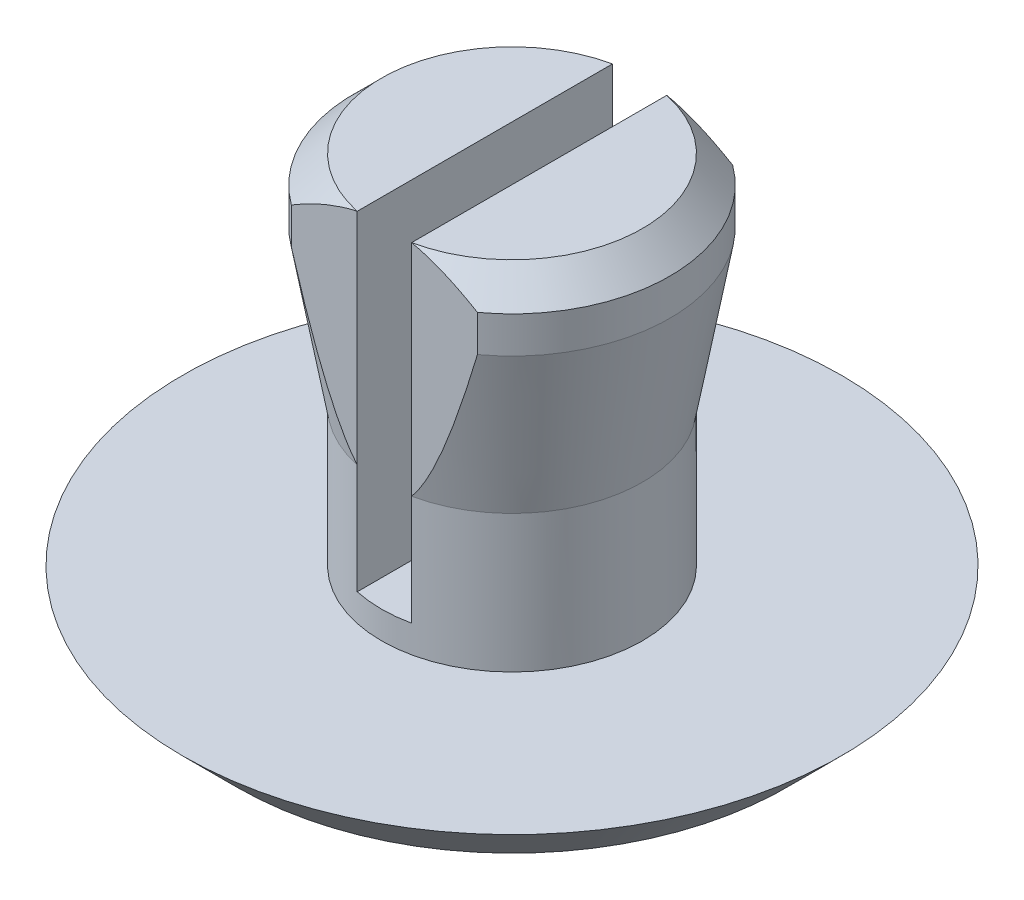
ISO-10303-21;
HEADER;
FILE_DESCRIPTION(('STEP AP214'),'2;1');
FILE_NAME('part.step','',(''),(''),'','','');
FILE_SCHEMA(('AUTOMOTIVE_DESIGN { 1 0 10303 214 1 1 1 1 }'));
ENDSEC;
DATA;
#1=APPLICATION_CONTEXT('core data for automotive mechanical design processes');
#2=APPLICATION_PROTOCOL_DEFINITION('international standard','automotive_design',2000,#1);
#3=PRODUCT_CONTEXT('',#1,'mechanical');
#4=PRODUCT('Part','Part','',(#3));
#5=PRODUCT_RELATED_PRODUCT_CATEGORY('part','',(#4));
#6=PRODUCT_DEFINITION_FORMATION('','',#4);
#7=PRODUCT_DEFINITION_CONTEXT('part definition',#1,'design');
#8=PRODUCT_DEFINITION('design','',#6,#7);
#9=PRODUCT_DEFINITION_SHAPE('','',#8);
#10=(LENGTH_UNIT() NAMED_UNIT(*) SI_UNIT(.MILLI.,.METRE.));
#11=(NAMED_UNIT(*) PLANE_ANGLE_UNIT() SI_UNIT($,.RADIAN.));
#12=(NAMED_UNIT(*) SI_UNIT($,.STERADIAN.) SOLID_ANGLE_UNIT());
#13=UNCERTAINTY_MEASURE_WITH_UNIT(LENGTH_MEASURE(1.E-05),#10,'distance_accuracy_value','');
#14=(GEOMETRIC_REPRESENTATION_CONTEXT(3) GLOBAL_UNCERTAINTY_ASSIGNED_CONTEXT((#13)) GLOBAL_UNIT_ASSIGNED_CONTEXT((#10,
#11,#12)) REPRESENTATION_CONTEXT('',''));
#15=CARTESIAN_POINT('',(0.,0.,0.));
#16=DIRECTION('',(0.,0.,1.));
#17=DIRECTION('',(1.,0.,0.));
#18=AXIS2_PLACEMENT_3D('',#15,#16,#17);
#19=CARTESIAN_POINT('',(0.,13.,0.));
#20=DIRECTION('',(0.,-1.,0.));
#21=DIRECTION('',(0.,0.,-1.));
#22=AXIS2_PLACEMENT_3D('',#19,#20,#21);
#23=CYLINDRICAL_SURFACE('',#22,4.75);
#24=CARTESIAN_POINT('',(0.,0.,0.));
#25=DIRECTION('',(0.,1.,0.));
#26=DIRECTION('',(0.,0.,1.));
#27=AXIS2_PLACEMENT_3D('',#24,#25,#26);
#28=CIRCLE('',#27,4.75);
#29=CARTESIAN_POINT('',(0.,0.,4.75));
#30=VERTEX_POINT('',#29);
#31=EDGE_CURVE('E165',#30,#30,#28,.T.);
#32=ORIENTED_EDGE('',*,*,#31,.T.);
#33=EDGE_LOOP('',(#32));
#34=FACE_BOUND('',#33,.T.);
#35=DIRECTION('',(0.,1.,0.));
#36=VECTOR('',#35,1.);
#37=CARTESIAN_POINT('',(0.989583333333333,0.999999999999999,-4.64577494357926));
#38=LINE('',#37,#36);
#39=CARTESIAN_POINT('',(0.989583333333333,0.999999999999999,-4.64577494357926));
#40=VERTEX_POINT('',#39);
#41=CARTESIAN_POINT('',(0.989583333333333,4.99999999999999,-4.64577494357926));
#42=VERTEX_POINT('',#41);
#43=EDGE_CURVE('E156',#40,#42,#38,.T.);
#44=ORIENTED_EDGE('',*,*,#43,.T.);
#45=CARTESIAN_POINT('',(0.,4.99999999999999,0.));
#46=DIRECTION('',(0.,1.,0.));
#47=DIRECTION('',(0.,0.,1.));
#48=AXIS2_PLACEMENT_3D('',#45,#46,#47);
#49=CIRCLE('',#48,4.75);
#50=CARTESIAN_POINT('',(0.989583333333333,4.99999999999999,4.64577494357926));
#51=VERTEX_POINT('',#50);
#52=EDGE_CURVE('E174',#42,#51,#49,.F.);
#53=ORIENTED_EDGE('',*,*,#52,.T.);
#54=DIRECTION('',(0.,1.,0.));
#55=VECTOR('',#54,1.);
#56=CARTESIAN_POINT('',(0.989583333333333,0.999999999999999,4.64577494357926));
#57=LINE('',#56,#55);
#58=CARTESIAN_POINT('',(0.989583333333333,0.999999999999999,4.64577494357926));
#59=VERTEX_POINT('',#58);
#60=EDGE_CURVE('E159',#59,#51,#57,.T.);
#61=ORIENTED_EDGE('',*,*,#60,.F.);
#62=CARTESIAN_POINT('',(0.,0.999999999999999,0.));
#63=DIRECTION('',(0.,1.,0.));
#64=DIRECTION('',(0.,0.,1.));
#65=AXIS2_PLACEMENT_3D('',#62,#63,#64);
#66=CIRCLE('',#65,4.75);
#67=CARTESIAN_POINT('',(-0.989583333333333,0.999999999999999,4.64577494357926));
#68=VERTEX_POINT('',#67);
#69=EDGE_CURVE('E140',#68,#59,#66,.T.);
#70=ORIENTED_EDGE('',*,*,#69,.F.);
#71=DIRECTION('',(0.,1.,0.));
#72=VECTOR('',#71,1.);
#73=CARTESIAN_POINT('',(-0.989583333333333,0.999999999999999,4.64577494357926));
#74=LINE('',#73,#72);
#75=CARTESIAN_POINT('',(-0.989583333333333,4.99999999999999,4.64577494357926));
#76=VERTEX_POINT('',#75);
#77=EDGE_CURVE('E151',#68,#76,#74,.T.);
#78=ORIENTED_EDGE('',*,*,#77,.T.);
#79=CARTESIAN_POINT('',(0.,4.99999999999999,0.));
#80=DIRECTION('',(0.,1.,0.));
#81=DIRECTION('',(0.,0.,1.));
#82=AXIS2_PLACEMENT_3D('',#79,#80,#81);
#83=CIRCLE('',#82,4.75);
#84=CARTESIAN_POINT('',(-0.989583333333332,4.99999999999999,-4.64577494357926));
#85=VERTEX_POINT('',#84);
#86=EDGE_CURVE('E171',#76,#85,#83,.F.);
#87=ORIENTED_EDGE('',*,*,#86,.T.);
#88=DIRECTION('',(0.,1.,0.));
#89=VECTOR('',#88,1.);
#90=CARTESIAN_POINT('',(-0.989583333333332,0.999999999999999,-4.64577494357926));
#91=LINE('',#90,#89);
#92=CARTESIAN_POINT('',(-0.989583333333332,0.999999999999999,-4.64577494357926));
#93=VERTEX_POINT('',#92);
#94=EDGE_CURVE('E154',#93,#85,#91,.T.);
#95=ORIENTED_EDGE('',*,*,#94,.F.);
#96=CARTESIAN_POINT('',(0.,0.999999999999999,0.));
#97=DIRECTION('',(0.,1.,0.));
#98=DIRECTION('',(0.,0.,1.));
#99=AXIS2_PLACEMENT_3D('',#96,#97,#98);
#100=CIRCLE('',#99,4.75);
#101=EDGE_CURVE('E436',#40,#93,#100,.T.);
#102=ORIENTED_EDGE('',*,*,#101,.F.);
#103=EDGE_LOOP('',(#44,#53,#61,#70,#78,#87,#95,#102));
#104=FACE_BOUND('',#103,.T.);
#105=ADVANCED_FACE('F35',(#34,#104),#23,.T.);
#106=CARTESIAN_POINT('',(0.,13.,0.));
#107=DIRECTION('',(0.,1.,0.));
#108=DIRECTION('',(0.,0.,1.));
#109=AXIS2_PLACEMENT_3D('',#106,#107,#108);
#110=PLANE('',#109);
#111=DIRECTION('',(0.,0.,1.));
#112=VECTOR('',#111,1.);
#113=CARTESIAN_POINT('',(-0.989583333333333,13.,4.64577494357926));
#114=LINE('',#113,#112);
#115=CARTESIAN_POINT('',(-0.989583333333332,13.,-4.64577494357926));
#116=VERTEX_POINT('',#115);
#117=CARTESIAN_POINT('',(-0.989583333333333,13.,4.64577494357926));
#118=VERTEX_POINT('',#117);
#119=EDGE_CURVE('E124',#116,#118,#114,.T.);
#120=ORIENTED_EDGE('',*,*,#119,.F.);
#121=CARTESIAN_POINT('',(0.,13.,0.));
#122=DIRECTION('',(0.,1.,0.));
#123=DIRECTION('',(0.,0.,1.));
#124=AXIS2_PLACEMENT_3D('',#121,#122,#123);
#125=CIRCLE('',#124,4.75000000000001);
#126=EDGE_CURVE('E118',#116,#118,#125,.T.);
#127=ORIENTED_EDGE('',*,*,#126,.T.);
#128=EDGE_LOOP('',(#120,#127));
#129=FACE_BOUND('',#128,.T.);
#130=ADVANCED_FACE('F122',(#129),#110,.T.);
#131=DIRECTION('',(0.,0.,-1.));
#132=VECTOR('',#131,1.);
#133=CARTESIAN_POINT('',(0.989583333333333,13.,4.64577494357926));
#134=LINE('',#133,#132);
#135=CARTESIAN_POINT('',(0.989583333333333,13.,4.64577494357926));
#136=VERTEX_POINT('',#135);
#137=CARTESIAN_POINT('',(0.989583333333333,13.,-4.64577494357926));
#138=VERTEX_POINT('',#137);
#139=EDGE_CURVE('E141',#136,#138,#134,.T.);
#140=ORIENTED_EDGE('',*,*,#139,.F.);
#141=CARTESIAN_POINT('',(0.,13.,0.));
#142=DIRECTION('',(0.,1.,0.));
#143=DIRECTION('',(0.,0.,1.));
#144=AXIS2_PLACEMENT_3D('',#141,#142,#143);
#145=CIRCLE('',#144,4.75000000000001);
#146=EDGE_CURVE('E221',#136,#138,#145,.T.);
#147=ORIENTED_EDGE('',*,*,#146,.T.);
#148=EDGE_LOOP('',(#140,#147));
#149=FACE_BOUND('',#148,.T.);
#150=ADVANCED_FACE('F259',(#149),#110,.T.);
#151=CARTESIAN_POINT('',(0.,-2.,0.));
#152=DIRECTION('',(0.,-1.,0.));
#153=DIRECTION('',(0.,0.,-1.));
#154=AXIS2_PLACEMENT_3D('',#151,#152,#153);
#155=PLANE('',#154);
#156=CARTESIAN_POINT('',(0.,-2.,0.));
#157=DIRECTION('',(0.,-1.,0.));
#158=DIRECTION('',(0.,0.,-1.));
#159=AXIS2_PLACEMENT_3D('',#156,#157,#158);
#160=CIRCLE('',#159,10.);
#161=CARTESIAN_POINT('',(0.,-2.,-10.));
#162=VERTEX_POINT('',#161);
#163=EDGE_CURVE('E168',#162,#162,#160,.T.);
#164=ORIENTED_EDGE('',*,*,#163,.T.);
#165=EDGE_LOOP('',(#164));
#166=FACE_BOUND('',#165,.T.);
#167=ADVANCED_FACE('F255',(#166),#155,.T.);
#168=CARTESIAN_POINT('',(0.,0.,0.));
#169=DIRECTION('',(0.,-1.,0.));
#170=DIRECTION('',(0.,0.,-1.));
#171=AXIS2_PLACEMENT_3D('',#168,#169,#170);
#172=PLANE('',#171);
#173=ORIENTED_EDGE('',*,*,#31,.F.);
#174=EDGE_LOOP('',(#173));
#175=FACE_BOUND('',#174,.T.);
#176=CARTESIAN_POINT('',(0.,0.,0.));
#177=DIRECTION('',(0.,-1.,0.));
#178=DIRECTION('',(0.,0.,-1.));
#179=AXIS2_PLACEMENT_3D('',#176,#177,#178);
#180=CIRCLE('',#179,12.);
#181=CARTESIAN_POINT('',(0.,0.,-12.));
#182=VERTEX_POINT('',#181);
#183=EDGE_CURVE('E153',#182,#182,#180,.T.);
#184=ORIENTED_EDGE('',*,*,#183,.F.);
#185=EDGE_LOOP('',(#184));
#186=FACE_BOUND('',#185,.T.);
#187=ADVANCED_FACE('F258',(#175,#186),#172,.F.);
#188=CARTESIAN_POINT('',(0.,-2.,0.));
#189=DIRECTION('',(0.,1.,0.));
#190=DIRECTION('',(0.,0.,1.));
#191=AXIS2_PLACEMENT_3D('',#188,#189,#190);
#192=CONICAL_SURFACE('',#191,10.,0.785398163397445);
#193=ORIENTED_EDGE('',*,*,#183,.T.);
#194=EDGE_LOOP('',(#193));
#195=FACE_BOUND('',#194,.T.);
#196=ORIENTED_EDGE('',*,*,#163,.F.);
#197=EDGE_LOOP('',(#196));
#198=FACE_BOUND('',#197,.T.);
#199=ADVANCED_FACE('F251',(#195,#198),#192,.T.);
#200=CARTESIAN_POINT('',(-0.989583333333333,0.999999999999999,4.64577494357926));
#201=DIRECTION('',(-1.,0.,0.));
#202=DIRECTION('',(0.,0.,1.));
#203=AXIS2_PLACEMENT_3D('',#200,#201,#202);
#204=PLANE('',#203);
#205=DIRECTION('',(0.,1.,0.));
#206=VECTOR('',#205,1.);
#207=CARTESIAN_POINT('',(-0.989583333333333,11.,4.64577494357926));
#208=LINE('',#207,#206);
#209=EDGE_CURVE('E128',#76,#118,#208,.T.);
#210=ORIENTED_EDGE('',*,*,#209,.F.);
#211=ORIENTED_EDGE('',*,*,#77,.F.);
#212=DIRECTION('',(0.,0.,1.));
#213=VECTOR('',#212,1.);
#214=CARTESIAN_POINT('',(-0.989583333333333,0.999999999999999,4.64577494357926));
#215=LINE('',#214,#213);
#216=EDGE_CURVE('E162',#93,#68,#215,.T.);
#217=ORIENTED_EDGE('',*,*,#216,.F.);
#218=ORIENTED_EDGE('',*,*,#94,.T.);
#219=DIRECTION('',(0.,1.,0.));
#220=VECTOR('',#219,1.);
#221=CARTESIAN_POINT('',(-0.989583333333332,11.,-4.64577494357926));
#222=LINE('',#221,#220);
#223=EDGE_CURVE('E135',#85,#116,#222,.T.);
#224=ORIENTED_EDGE('',*,*,#223,.T.);
#225=ORIENTED_EDGE('',*,*,#119,.T.);
#226=EDGE_LOOP('',(#210,#211,#217,#218,#224,#225));
#227=FACE_BOUND('',#226,.T.);
#228=ADVANCED_FACE('F138',(#227),#204,.F.);
#229=CARTESIAN_POINT('',(0.989583333333333,0.999999999999999,4.64577494357926));
#230=DIRECTION('',(1.,0.,0.));
#231=DIRECTION('',(0.,0.,-1.));
#232=AXIS2_PLACEMENT_3D('',#229,#230,#231);
#233=PLANE('',#232);
#234=DIRECTION('',(0.,1.,0.));
#235=VECTOR('',#234,1.);
#236=CARTESIAN_POINT('',(0.989583333333333,11.,-4.64577494357926));
#237=LINE('',#236,#235);
#238=EDGE_CURVE('E448',#42,#138,#237,.T.);
#239=ORIENTED_EDGE('',*,*,#238,.F.);
#240=ORIENTED_EDGE('',*,*,#43,.F.);
#241=DIRECTION('',(0.,0.,-1.));
#242=VECTOR('',#241,1.);
#243=CARTESIAN_POINT('',(0.989583333333333,0.999999999999999,4.64577494357926));
#244=LINE('',#243,#242);
#245=EDGE_CURVE('E144',#59,#40,#244,.T.);
#246=ORIENTED_EDGE('',*,*,#245,.F.);
#247=ORIENTED_EDGE('',*,*,#60,.T.);
#248=DIRECTION('',(0.,1.,0.));
#249=VECTOR('',#248,1.);
#250=CARTESIAN_POINT('',(0.989583333333333,11.,4.64577494357926));
#251=LINE('',#250,#249);
#252=EDGE_CURVE('E147',#51,#136,#251,.T.);
#253=ORIENTED_EDGE('',*,*,#252,.T.);
#254=ORIENTED_EDGE('',*,*,#139,.T.);
#255=EDGE_LOOP('',(#239,#240,#246,#247,#253,#254));
#256=FACE_BOUND('',#255,.T.);
#257=ADVANCED_FACE('F247',(#256),#233,.F.);
#258=CARTESIAN_POINT('',(0.,0.999999999999999,0.));
#259=DIRECTION('',(0.,1.,0.));
#260=DIRECTION('',(0.,0.,1.));
#261=AXIS2_PLACEMENT_3D('',#258,#259,#260);
#262=PLANE('',#261);
#263=ORIENTED_EDGE('',*,*,#69,.T.);
#264=ORIENTED_EDGE('',*,*,#245,.T.);
#265=ORIENTED_EDGE('',*,*,#101,.T.);
#266=ORIENTED_EDGE('',*,*,#216,.T.);
#267=EDGE_LOOP('',(#263,#264,#265,#266));
#268=FACE_BOUND('',#267,.T.);
#269=ADVANCED_FACE('F206',(#268),#262,.T.);
#270=CARTESIAN_POINT('',(1.19791666666667,11.,-4.64577494357926));
#271=DIRECTION('',(0.,0.,-1.));
#272=DIRECTION('',(-1.,0.,0.));
#273=AXIS2_PLACEMENT_3D('',#270,#271,#272);
#274=PLANE('',#273);
#275=ORIENTED_EDGE('',*,*,#238,.T.);
#276=CARTESIAN_POINT('',(0.989583333333374,13.,-4.64577494357926));
#277=CARTESIAN_POINT('',(1.1704144437749,12.9623485183072,-4.64577494357926));
#278=CARTESIAN_POINT('',(1.34896676657053,12.9152410110718,-4.64577494357926));
#279=CARTESIAN_POINT('',(1.70079930281116,12.80549664553,-4.64577494357926));
#280=CARTESIAN_POINT('',(1.87409139003593,12.742898220408,-4.64577494357926));
#281=CARTESIAN_POINT('',(2.21413384928068,12.6059203719835,-4.64577494357926));
#282=CARTESIAN_POINT('',(2.38092719855641,12.5316452283715,-4.64577494357926));
#283=CARTESIAN_POINT('',(2.70997280545489,12.3735370694812,-4.64577494357926));
#284=CARTESIAN_POINT('',(2.87222321243173,12.2897002276542,-4.64577494357926));
#285=CARTESIAN_POINT('',(3.09219439612242,12.169462953325,-4.64577494357926));
#286=CARTESIAN_POINT('',(3.15169531277584,12.136263771413,-4.64577494357926));
#287=CARTESIAN_POINT('',(3.27025226605008,12.0688564150114,-4.64577494357926));
#288=CARTESIAN_POINT('',(3.3293074131424,12.034646675219,-4.64577494357926));
#289=CARTESIAN_POINT('',(3.38810790465875,12.,-4.64577494357926));
#290=B_SPLINE_CURVE_WITH_KNOTS('',3,(#276,#277,#278,#279,#280,#281,#282,#283,#284,#285,#286,
#287,#288,#289),.UNSPECIFIED.,.F.,.F.,(4,2,2,2,2,2,4),(0.,0.553437571154139,1.10551558539893,
1.65291733684754,2.2005389298332,2.40494245132195,2.60968115995911),.UNSPECIFIED.);
#291=CARTESIAN_POINT('',(3.38810790465875,12.,-4.64577494357926));
#292=VERTEX_POINT('',#291);
#293=EDGE_CURVE('E213',#138,#292,#290,.T.);
#294=ORIENTED_EDGE('',*,*,#293,.T.);
#295=DIRECTION('',(0.,1.,0.));
#296=VECTOR('',#295,1.);
#297=CARTESIAN_POINT('',(3.38810790465875,11.,-4.64577494357926));
#298=LINE('',#297,#296);
#299=CARTESIAN_POINT('',(3.38810790465875,10.6712818196175,-4.64577494357926));
#300=VERTEX_POINT('',#299);
#301=EDGE_CURVE('E444',#300,#292,#298,.T.);
#302=ORIENTED_EDGE('',*,*,#301,.F.);
#303=CARTESIAN_POINT('',(3.38810790465875,10.6712818196175,-4.64577494357926));
#304=CARTESIAN_POINT('',(3.32689507981117,10.4667902059364,-4.64577494357926));
#305=CARTESIAN_POINT('',(3.26472138914247,10.2625807146368,-4.64577494357926));
#306=CARTESIAN_POINT('',(3.13802966150101,9.85485143376169,-4.64577494357926));
#307=CARTESIAN_POINT('',(3.0735112108908,9.65133177286973,-4.64577494357926));
#308=CARTESIAN_POINT('',(2.94134554328581,9.2439991590162,-4.64577494357926));
#309=CARTESIAN_POINT('',(2.87368231202682,9.04019138427731,-4.64577494357926));
#310=CARTESIAN_POINT('',(2.73500090905716,8.63373687278263,-4.64577494357926));
#311=CARTESIAN_POINT('',(2.66398304466084,8.43109003157468,-4.64577494357926));
#312=CARTESIAN_POINT('',(2.51946851941549,8.03189720066862,-4.64577494357926));
#313=CARTESIAN_POINT('',(2.44606536536933,7.83531749523216,-4.64577494357926));
#314=CARTESIAN_POINT('',(2.29427577443733,7.44409467586185,-4.64577494357926));
#315=CARTESIAN_POINT('',(2.21588974797021,7.24945140395526,-4.64577494357926));
#316=CARTESIAN_POINT('',(2.05278398587863,6.86329553279851,-4.64577494357926));
#317=CARTESIAN_POINT('',(1.96807763968195,6.67177730708104,-4.64577494357926));
#318=CARTESIAN_POINT('',(1.78992646796999,6.29287866862716,-4.64577494357926));
#319=CARTESIAN_POINT('',(1.69648643426461,6.10549605580919,-4.64577494357926));
#320=CARTESIAN_POINT('',(1.55284965792189,5.84078048423702,-4.64577494357926));
#321=CARTESIAN_POINT('',(1.50779032849719,5.76066560453151,-4.64577494357926));
#322=CARTESIAN_POINT('',(1.4146804995963,5.60222811192271,-4.64577494357926));
#323=CARTESIAN_POINT('',(1.36663118622447,5.52390480496681,-4.64577494357926));
#324=CARTESIAN_POINT('',(1.26665224880521,5.36925584519352,-4.64577494357926));
#325=CARTESIAN_POINT('',(1.21470673388737,5.29294030296848,-4.64577494357926));
#326=CARTESIAN_POINT('',(1.10600274691602,5.14364863672468,-4.64577494357926));
#327=CARTESIAN_POINT('',(1.04923662972952,5.07067811085333,-4.64577494357926));
#328=CARTESIAN_POINT('',(0.98958333333409,4.99999999999958,-4.64577494357926));
#329=B_SPLINE_CURVE_WITH_KNOTS('',3,(#303,#304,#305,#306,#307,#308,#309,#310,#311,#312,#313,
#314,#315,#316,#317,#318,#319,#320,#321,#322,#323,#324,#325,#326,#327,#328),.UNSPECIFIED.,.F.,
.F.,(4,2,2,2,2,2,2,2,2,2,2,2,4),(0.,0.640376093782088,1.28086570950586,1.92508034570645,
2.56923608011796,3.19869691712519,3.82810597504066,4.4562175664296,5.08398653977725,
5.35968560034467,5.63527598187361,5.9120588740068,6.18928922889526),.UNSPECIFIED.);
#330=EDGE_CURVE('E180',#300,#42,#329,.T.);
#331=ORIENTED_EDGE('',*,*,#330,.T.);
#332=EDGE_LOOP('',(#275,#294,#302,#331));
#333=FACE_BOUND('',#332,.T.);
#334=ADVANCED_FACE('F201',(#333),#274,.T.);
#335=CARTESIAN_POINT('',(0.,11.,0.));
#336=DIRECTION('',(0.,1.,0.));
#337=DIRECTION('',(0.,0.,1.));
#338=AXIS2_PLACEMENT_3D('',#335,#336,#337);
#339=CYLINDRICAL_SURFACE('',#338,5.75);
#340=ORIENTED_EDGE('',*,*,#301,.T.);
#341=CARTESIAN_POINT('',(0.,12.,0.));
#342=DIRECTION('',(0.,1.,0.));
#343=DIRECTION('',(0.,0.,1.));
#344=AXIS2_PLACEMENT_3D('',#341,#342,#343);
#345=CIRCLE('',#344,5.75);
#346=CARTESIAN_POINT('',(3.38810790465875,12.,4.64577494357926));
#347=VERTEX_POINT('',#346);
#348=EDGE_CURVE('E220',#292,#347,#345,.F.);
#349=ORIENTED_EDGE('',*,*,#348,.T.);
#350=DIRECTION('',(0.,1.,0.));
#351=VECTOR('',#350,1.);
#352=CARTESIAN_POINT('',(3.38810790465875,11.,4.64577494357926));
#353=LINE('',#352,#351);
#354=CARTESIAN_POINT('',(3.38810790465875,10.6712818196175,4.64577494357926));
#355=VERTEX_POINT('',#354);
#356=EDGE_CURVE('E441',#355,#347,#353,.T.);
#357=ORIENTED_EDGE('',*,*,#356,.F.);
#358=CARTESIAN_POINT('',(0.,10.6712818196175,0.));
#359=DIRECTION('',(0.,1.,0.));
#360=DIRECTION('',(0.,0.,1.));
#361=AXIS2_PLACEMENT_3D('',#358,#359,#360);
#362=CIRCLE('',#361,5.75);
#363=EDGE_CURVE('E177',#355,#300,#362,.T.);
#364=ORIENTED_EDGE('',*,*,#363,.T.);
#365=EDGE_LOOP('',(#340,#349,#357,#364));
#366=FACE_BOUND('',#365,.T.);
#367=ADVANCED_FACE('F205',(#366),#339,.T.);
#368=CARTESIAN_POINT('',(1.19791666666667,11.,4.64577494357926));
#369=DIRECTION('',(0.,0.,1.));
#370=DIRECTION('',(1.,0.,0.));
#371=AXIS2_PLACEMENT_3D('',#368,#369,#370);
#372=PLANE('',#371);
#373=ORIENTED_EDGE('',*,*,#356,.T.);
#374=CARTESIAN_POINT('',(3.38810790465875,12.,4.64577494357926));
#375=CARTESIAN_POINT('',(3.29422662968021,12.0553075510659,4.64577494357926));
#376=CARTESIAN_POINT('',(3.19968988989585,12.1095212228469,4.64577494357926));
#377=CARTESIAN_POINT('',(3.0091595590965,12.2153854547663,4.64577494357926));
#378=CARTESIAN_POINT('',(2.91316556911508,12.2670352958281,4.64577494357926));
#379=CARTESIAN_POINT('',(2.72026520531105,12.3670344088568,4.64577494357926));
#380=CARTESIAN_POINT('',(2.6233690229582,12.4154032005753,4.64577494357926));
#381=CARTESIAN_POINT('',(2.42796339905657,12.5087347285217,4.64577494357926));
#382=CARTESIAN_POINT('',(2.32945397968508,12.5536975115246,4.64577494357926));
#383=CARTESIAN_POINT('',(2.03090002461446,12.6828975386296,4.64577494357926));
#384=CARTESIAN_POINT('',(1.82819834205069,12.7612510644232,4.64577494357926));
#385=CARTESIAN_POINT('',(1.41465164980789,12.8975612788984,4.64577494357926));
#386=CARTESIAN_POINT('',(1.20376177250055,12.9553801259772,4.64577494357926));
#387=CARTESIAN_POINT('',(0.989583333333375,13.,4.64577494357926));
#388=B_SPLINE_CURVE_WITH_KNOTS('',3,(#374,#375,#376,#377,#378,#379,#380,#381,#382,#383,#384,
#385,#386,#387),.UNSPECIFIED.,.F.,.F.,(4,2,2,2,2,2,4),(0.,0.326890348493636,0.65387186768133,
0.978697073836121,1.30351781833841,1.95440810409695,2.60958847673408),.UNSPECIFIED.);
#389=EDGE_CURVE('E125',#347,#136,#388,.T.);
#390=ORIENTED_EDGE('',*,*,#389,.T.);
#391=ORIENTED_EDGE('',*,*,#252,.F.);
#392=CARTESIAN_POINT('',(0.989583333333333,4.99999999999999,4.64577494357926));
#393=CARTESIAN_POINT('',(1.04543394988145,5.06614425723856,4.64577494357926));
#394=CARTESIAN_POINT('',(1.0987426951434,5.13431856892697,4.64577494357926));
#395=CARTESIAN_POINT('',(1.20108042466068,5.27368840449876,4.64577494357926));
#396=CARTESIAN_POINT('',(1.25011479135293,5.34487995594756,4.64577494357926));
#397=CARTESIAN_POINT('',(1.34467882499284,5.48916414227866,4.64577494357926));
#398=CARTESIAN_POINT('',(1.39022025424904,5.56224917790845,4.64577494357926));
#399=CARTESIAN_POINT('',(1.47857741070101,5.71007852776741,4.64577494357926));
#400=CARTESIAN_POINT('',(1.5213921255126,5.78482344455129,4.64577494357926));
#401=CARTESIAN_POINT('',(1.64592081133834,6.01000610904117,4.64577494357926));
#402=CARTESIAN_POINT('',(1.72428939296614,6.16229094721627,4.64577494357926));
#403=CARTESIAN_POINT('',(1.87457905864565,6.47016777444215,4.64577494357926));
#404=CARTESIAN_POINT('',(1.94649275973057,6.62576330488003,4.64577494357926));
#405=CARTESIAN_POINT('',(2.08513437114091,6.93875052226328,4.64577494357926));
#406=CARTESIAN_POINT('',(2.15187535080048,7.09613644812463,4.64577494357926));
#407=CARTESIAN_POINT('',(2.28141809208066,7.41252297068559,4.64577494357926));
#408=CARTESIAN_POINT('',(2.34421957845372,7.57152367930828,4.64577494357926));
#409=CARTESIAN_POINT('',(2.52784992784527,8.05029748738869,4.64577494357926));
#410=CARTESIAN_POINT('',(2.64392563822759,8.37189102895908,4.64577494357926));
#411=CARTESIAN_POINT('',(2.86860636879878,9.02201502733891,4.64577494357926));
#412=CARTESIAN_POINT('',(2.97710329345651,9.35058227680473,4.64577494357926));
#413=CARTESIAN_POINT('',(3.13476251815817,9.84491509506291,4.64577494357926));
#414=CARTESIAN_POINT('',(3.186450522451,10.0098811050196,4.64577494357926));
#415=CARTESIAN_POINT('',(3.28834205675284,10.3402616071535,4.64577494357926));
#416=CARTESIAN_POINT('',(3.33854566597348,10.5056760748835,4.64577494357926));
#417=CARTESIAN_POINT('',(3.38810790465988,10.671281819617,4.64577494357926));
#418=B_SPLINE_CURVE_WITH_KNOTS('',3,(#392,#393,#394,#395,#396,#397,#398,#399,#400,#401,#402,
#403,#404,#405,#406,#407,#408,#409,#410,#411,#412,#413,#414,#415,#416,#417),.UNSPECIFIED.,.F.,
.F.,(4,2,2,2,2,2,2,2,2,2,2,2,4),(0.,0.259521167771296,0.518710669327797,0.776985089914756,
1.03535485112441,1.54890643848071,2.06303812406135,2.57582532819803,3.08864832032936,
4.11413521790506,5.15210083540624,5.67071705084435,6.18930554128869),.UNSPECIFIED.);
#419=EDGE_CURVE('E189',#51,#355,#418,.T.);
#420=ORIENTED_EDGE('',*,*,#419,.T.);
#421=EDGE_LOOP('',(#373,#390,#391,#420));
#422=FACE_BOUND('',#421,.T.);
#423=ADVANCED_FACE('F239',(#422),#372,.T.);
#424=CARTESIAN_POINT('',(-1.19791666666667,11.,4.64577494357926));
#425=DIRECTION('',(0.,0.,1.));
#426=DIRECTION('',(1.,0.,0.));
#427=AXIS2_PLACEMENT_3D('',#424,#425,#426);
#428=PLANE('',#427);
#429=ORIENTED_EDGE('',*,*,#209,.T.);
#430=CARTESIAN_POINT('',(-0.989583333333372,13.,4.64577494357926));
#431=CARTESIAN_POINT('',(-1.1704144437749,12.9623485183072,4.64577494357926));
#432=CARTESIAN_POINT('',(-1.34896676657053,12.9152410110718,4.64577494357926));
#433=CARTESIAN_POINT('',(-1.70079930281115,12.80549664553,4.64577494357926));
#434=CARTESIAN_POINT('',(-1.87409139003593,12.742898220408,4.64577494357926));
#435=CARTESIAN_POINT('',(-2.21413384928068,12.6059203719835,4.64577494357926));
#436=CARTESIAN_POINT('',(-2.3809271985564,12.5316452283715,4.64577494357926));
#437=CARTESIAN_POINT('',(-2.70997280545488,12.3735370694812,4.64577494357926));
#438=CARTESIAN_POINT('',(-2.87222321243173,12.2897002276542,4.64577494357926));
#439=CARTESIAN_POINT('',(-3.09219439612242,12.169462953325,4.64577494357926));
#440=CARTESIAN_POINT('',(-3.15169531277584,12.136263771413,4.64577494357926));
#441=CARTESIAN_POINT('',(-3.27025226605008,12.0688564150114,4.64577494357926));
#442=CARTESIAN_POINT('',(-3.3293074131424,12.034646675219,4.64577494357926));
#443=CARTESIAN_POINT('',(-3.38810790465875,12.,4.64577494357926));
#444=B_SPLINE_CURVE_WITH_KNOTS('',3,(#430,#431,#432,#433,#434,#435,#436,#437,#438,#439,#440,
#441,#442,#443),.UNSPECIFIED.,.F.,.F.,(4,2,2,2,2,2,4),(0.,0.553437571154136,1.10551558539892,
1.65291733684754,2.20053892983319,2.40494245132195,2.60968115995911),.UNSPECIFIED.);
#445=CARTESIAN_POINT('',(-3.38810790465875,12.,4.64577494357926));
#446=VERTEX_POINT('',#445);
#447=EDGE_CURVE('E64',#118,#446,#444,.T.);
#448=ORIENTED_EDGE('',*,*,#447,.T.);
#449=DIRECTION('',(0.,1.,0.));
#450=VECTOR('',#449,1.);
#451=CARTESIAN_POINT('',(-3.38810790465875,11.,4.64577494357926));
#452=LINE('',#451,#450);
#453=CARTESIAN_POINT('',(-3.38810790465875,10.6712818196174,4.64577494357926));
#454=VERTEX_POINT('',#453);
#455=EDGE_CURVE('E445',#454,#446,#452,.T.);
#456=ORIENTED_EDGE('',*,*,#455,.F.);
#457=CARTESIAN_POINT('',(-3.38810790465875,10.6712818196174,4.64577494357926));
#458=CARTESIAN_POINT('',(-3.32689507981117,10.4667902059364,4.64577494357926));
#459=CARTESIAN_POINT('',(-3.26472138914247,10.2625807146368,4.64577494357926));
#460=CARTESIAN_POINT('',(-3.13802966150101,9.85485143376168,4.64577494357926));
#461=CARTESIAN_POINT('',(-3.0735112108908,9.65133177286973,4.64577494357926));
#462=CARTESIAN_POINT('',(-2.94134554328581,9.24399915901619,4.64577494357926));
#463=CARTESIAN_POINT('',(-2.87368231202682,9.04019138427731,4.64577494357926));
#464=CARTESIAN_POINT('',(-2.73500090905717,8.63373687278263,4.64577494357926));
#465=CARTESIAN_POINT('',(-2.66398304466084,8.43109003157468,4.64577494357926));
#466=CARTESIAN_POINT('',(-2.51946851941549,8.03189720066863,4.64577494357926));
#467=CARTESIAN_POINT('',(-2.44606536536933,7.83531749523217,4.64577494357926));
#468=CARTESIAN_POINT('',(-2.29427577443734,7.44409467586186,4.64577494357926));
#469=CARTESIAN_POINT('',(-2.21588974797021,7.24945140395528,4.64577494357926));
#470=CARTESIAN_POINT('',(-2.05278398587864,6.86329553279852,4.64577494357926));
#471=CARTESIAN_POINT('',(-1.96807763968196,6.67177730708105,4.64577494357926));
#472=CARTESIAN_POINT('',(-1.78992646797,6.29287866862718,4.64577494357926));
#473=CARTESIAN_POINT('',(-1.69648643426462,6.10549605580921,4.64577494357926));
#474=CARTESIAN_POINT('',(-1.55284965792189,5.84078048423704,4.64577494357926));
#475=CARTESIAN_POINT('',(-1.5077903284972,5.76066560453152,4.64577494357926));
#476=CARTESIAN_POINT('',(-1.41468049959631,5.60222811192272,4.64577494357926));
#477=CARTESIAN_POINT('',(-1.36663118622447,5.52390480496682,4.64577494357926));
#478=CARTESIAN_POINT('',(-1.26665224880521,5.36925584519352,4.64577494357926));
#479=CARTESIAN_POINT('',(-1.21470673388738,5.29294030296848,4.64577494357926));
#480=CARTESIAN_POINT('',(-1.10600274691603,5.14364863672468,4.64577494357926));
#481=CARTESIAN_POINT('',(-1.04923662972952,5.07067811085332,4.64577494357926));
#482=CARTESIAN_POINT('',(-0.989583333334088,4.99999999999958,4.64577494357926));
#483=B_SPLINE_CURVE_WITH_KNOTS('',3,(#457,#458,#459,#460,#461,#462,#463,#464,#465,#466,#467,
#468,#469,#470,#471,#472,#473,#474,#475,#476,#477,#478,#479,#480,#481,#482),.UNSPECIFIED.,.F.,
.F.,(4,2,2,2,2,2,2,2,2,2,2,2,4),(0.,0.640376093782085,1.28086570950585,1.92508034570644,
2.56923608011795,3.19869691712517,3.82810597504063,4.45621756642957,5.08398653977721,
5.35968560034464,5.6352759818736,5.91205887400679,6.18928922889525),.UNSPECIFIED.);
#484=EDGE_CURVE('E131',#454,#76,#483,.T.);
#485=ORIENTED_EDGE('',*,*,#484,.T.);
#486=EDGE_LOOP('',(#429,#448,#456,#485));
#487=FACE_BOUND('',#486,.T.);
#488=ADVANCED_FACE('F129',(#487),#428,.T.);
#489=CARTESIAN_POINT('',(0.,11.,0.));
#490=DIRECTION('',(0.,1.,0.));
#491=DIRECTION('',(0.,0.,1.));
#492=AXIS2_PLACEMENT_3D('',#489,#490,#491);
#493=CYLINDRICAL_SURFACE('',#492,5.75);
#494=ORIENTED_EDGE('',*,*,#455,.T.);
#495=CARTESIAN_POINT('',(0.,12.,0.));
#496=DIRECTION('',(0.,1.,0.));
#497=DIRECTION('',(0.,0.,1.));
#498=AXIS2_PLACEMENT_3D('',#495,#496,#497);
#499=CIRCLE('',#498,5.75);
#500=CARTESIAN_POINT('',(-3.38810790465875,12.,-4.64577494357926));
#501=VERTEX_POINT('',#500);
#502=EDGE_CURVE('E50',#446,#501,#499,.F.);
#503=ORIENTED_EDGE('',*,*,#502,.T.);
#504=DIRECTION('',(0.,1.,0.));
#505=VECTOR('',#504,1.);
#506=CARTESIAN_POINT('',(-3.38810790465875,11.,-4.64577494357926));
#507=LINE('',#506,#505);
#508=CARTESIAN_POINT('',(-3.38810790465875,10.6712818196174,-4.64577494357926));
#509=VERTEX_POINT('',#508);
#510=EDGE_CURVE('E454',#509,#501,#507,.T.);
#511=ORIENTED_EDGE('',*,*,#510,.F.);
#512=CARTESIAN_POINT('',(0.,10.6712818196174,0.));
#513=DIRECTION('',(0.,1.,0.));
#514=DIRECTION('',(0.,0.,1.));
#515=AXIS2_PLACEMENT_3D('',#512,#513,#514);
#516=CIRCLE('',#515,5.75);
#517=EDGE_CURVE('E429',#509,#454,#516,.T.);
#518=ORIENTED_EDGE('',*,*,#517,.T.);
#519=EDGE_LOOP('',(#494,#503,#511,#518));
#520=FACE_BOUND('',#519,.T.);
#521=ADVANCED_FACE('F317',(#520),#493,.T.);
#522=CARTESIAN_POINT('',(-1.19791666666667,11.,-4.64577494357926));
#523=DIRECTION('',(0.,0.,-1.));
#524=DIRECTION('',(-1.,0.,0.));
#525=AXIS2_PLACEMENT_3D('',#522,#523,#524);
#526=PLANE('',#525);
#527=ORIENTED_EDGE('',*,*,#510,.T.);
#528=CARTESIAN_POINT('',(-3.38810790465875,12.,-4.64577494357926));
#529=CARTESIAN_POINT('',(-3.29422662968021,12.0553075510659,-4.64577494357926));
#530=CARTESIAN_POINT('',(-3.19968988989585,12.1095212228469,-4.64577494357926));
#531=CARTESIAN_POINT('',(-3.0091595590965,12.2153854547663,-4.64577494357926));
#532=CARTESIAN_POINT('',(-2.91316556911507,12.2670352958281,-4.64577494357926));
#533=CARTESIAN_POINT('',(-2.72026520531105,12.3670344088568,-4.64577494357926));
#534=CARTESIAN_POINT('',(-2.62336902295819,12.4154032005753,-4.64577494357926));
#535=CARTESIAN_POINT('',(-2.42796339905657,12.5087347285217,-4.64577494357926));
#536=CARTESIAN_POINT('',(-2.32945397968507,12.5536975115246,-4.64577494357926));
#537=CARTESIAN_POINT('',(-2.03090002461446,12.6828975386296,-4.64577494357926));
#538=CARTESIAN_POINT('',(-1.82819834205069,12.7612510644232,-4.64577494357926));
#539=CARTESIAN_POINT('',(-1.41465164980789,12.8975612788984,-4.64577494357926));
#540=CARTESIAN_POINT('',(-1.20376177250054,12.9553801259772,-4.64577494357926));
#541=CARTESIAN_POINT('',(-0.98958333333337,13.,-4.64577494357926));
#542=B_SPLINE_CURVE_WITH_KNOTS('',3,(#528,#529,#530,#531,#532,#533,#534,#535,#536,#537,#538,
#539,#540,#541),.UNSPECIFIED.,.F.,.F.,(4,2,2,2,2,2,4),(0.,0.326890348493635,0.65387186768133,
0.978697073836121,1.30351781833841,1.95440810409695,2.60958847673408),.UNSPECIFIED.);
#543=EDGE_CURVE('E11',#501,#116,#542,.T.);
#544=ORIENTED_EDGE('',*,*,#543,.T.);
#545=ORIENTED_EDGE('',*,*,#223,.F.);
#546=CARTESIAN_POINT('',(-0.989583333333332,4.99999999999999,-4.64577494357926));
#547=CARTESIAN_POINT('',(-1.04543394988144,5.06614425723856,-4.64577494357926));
#548=CARTESIAN_POINT('',(-1.09874269514339,5.13431856892697,-4.64577494357926));
#549=CARTESIAN_POINT('',(-1.20108042466068,5.27368840449876,-4.64577494357926));
#550=CARTESIAN_POINT('',(-1.25011479135293,5.34487995594756,-4.64577494357926));
#551=CARTESIAN_POINT('',(-1.34467882499284,5.48916414227866,-4.64577494357926));
#552=CARTESIAN_POINT('',(-1.39022025424904,5.56224917790845,-4.64577494357926));
#553=CARTESIAN_POINT('',(-1.47857741070101,5.71007852776741,-4.64577494357926));
#554=CARTESIAN_POINT('',(-1.5213921255126,5.78482344455129,-4.64577494357926));
#555=CARTESIAN_POINT('',(-1.64592081133834,6.01000610904118,-4.64577494357926));
#556=CARTESIAN_POINT('',(-1.72428939296614,6.16229094721627,-4.64577494357926));
#557=CARTESIAN_POINT('',(-1.87457905864565,6.47016777444215,-4.64577494357926));
#558=CARTESIAN_POINT('',(-1.94649275973057,6.62576330488003,-4.64577494357926));
#559=CARTESIAN_POINT('',(-2.0851343711409,6.93875052226328,-4.64577494357926));
#560=CARTESIAN_POINT('',(-2.15187535080048,7.09613644812463,-4.64577494357926));
#561=CARTESIAN_POINT('',(-2.28141809208065,7.41252297068559,-4.64577494357926));
#562=CARTESIAN_POINT('',(-2.34421957845372,7.57152367930828,-4.64577494357926));
#563=CARTESIAN_POINT('',(-2.52784992784527,8.05029748738869,-4.64577494357926));
#564=CARTESIAN_POINT('',(-2.64392563822759,8.37189102895908,-4.64577494357926));
#565=CARTESIAN_POINT('',(-2.86860636879878,9.02201502733891,-4.64577494357926));
#566=CARTESIAN_POINT('',(-2.97710329345651,9.35058227680473,-4.64577494357926));
#567=CARTESIAN_POINT('',(-3.13476251815817,9.8449150950629,-4.64577494357926));
#568=CARTESIAN_POINT('',(-3.18645052245099,10.0098811050196,-4.64577494357926));
#569=CARTESIAN_POINT('',(-3.28834205675284,10.3402616071534,-4.64577494357926));
#570=CARTESIAN_POINT('',(-3.33854566597348,10.5056760748835,-4.64577494357926));
#571=CARTESIAN_POINT('',(-3.38810790465988,10.6712818196169,-4.64577494357926));
#572=B_SPLINE_CURVE_WITH_KNOTS('',3,(#546,#547,#548,#549,#550,#551,#552,#553,#554,#555,#556,
#557,#558,#559,#560,#561,#562,#563,#564,#565,#566,#567,#568,#569,#570,#571),.UNSPECIFIED.,.F.,
.F.,(4,2,2,2,2,2,2,2,2,2,2,2,4),(0.,0.259521167771295,0.518710669327796,0.776985089914755,
1.03535485112441,1.54890643848071,2.06303812406135,2.57582532819803,3.08864832032936,
4.11413521790506,5.15210083540624,5.67071705084435,6.18930554128868),.UNSPECIFIED.);
#573=EDGE_CURVE('E427',#85,#509,#572,.T.);
#574=ORIENTED_EDGE('',*,*,#573,.T.);
#575=EDGE_LOOP('',(#527,#544,#545,#574));
#576=FACE_BOUND('',#575,.T.);
#577=ADVANCED_FACE('F208',(#576),#526,.T.);
#578=CARTESIAN_POINT('',(0.,11.,0.));
#579=DIRECTION('',(0.,1.,0.));
#580=DIRECTION('',(0.,0.,1.));
#581=AXIS2_PLACEMENT_3D('',#578,#579,#580);
#582=CONICAL_SURFACE('',#581,5.80796188425084,0.17453292519944);
#583=ORIENTED_EDGE('',*,*,#419,.F.);
#584=ORIENTED_EDGE('',*,*,#52,.F.);
#585=ORIENTED_EDGE('',*,*,#330,.F.);
#586=ORIENTED_EDGE('',*,*,#363,.F.);
#587=EDGE_LOOP('',(#583,#584,#585,#586));
#588=FACE_BOUND('',#587,.T.);
#589=ADVANCED_FACE('F197',(#588),#582,.T.);
#590=CARTESIAN_POINT('',(0.,11.,0.));
#591=DIRECTION('',(0.,1.,0.));
#592=DIRECTION('',(0.,0.,1.));
#593=AXIS2_PLACEMENT_3D('',#590,#591,#592);
#594=CONICAL_SURFACE('',#593,5.80796188425084,0.17453292519944);
#595=ORIENTED_EDGE('',*,*,#573,.F.);
#596=ORIENTED_EDGE('',*,*,#86,.F.);
#597=ORIENTED_EDGE('',*,*,#484,.F.);
#598=ORIENTED_EDGE('',*,*,#517,.F.);
#599=EDGE_LOOP('',(#595,#596,#597,#598));
#600=FACE_BOUND('',#599,.T.);
#601=ADVANCED_FACE('F231',(#600),#594,.T.);
#602=CARTESIAN_POINT('',(0.,13.,0.));
#603=DIRECTION('',(0.,-1.,0.));
#604=DIRECTION('',(0.,0.,-1.));
#605=AXIS2_PLACEMENT_3D('',#602,#603,#604);
#606=CONICAL_SURFACE('',#605,4.75000000000001,0.785398163397447);
#607=ORIENTED_EDGE('',*,*,#389,.F.);
#608=ORIENTED_EDGE('',*,*,#348,.F.);
#609=ORIENTED_EDGE('',*,*,#293,.F.);
#610=ORIENTED_EDGE('',*,*,#146,.F.);
#611=EDGE_LOOP('',(#607,#608,#609,#610));
#612=FACE_BOUND('',#611,.T.);
#613=ADVANCED_FACE('F225',(#612),#606,.T.);
#614=CARTESIAN_POINT('',(0.,13.,0.));
#615=DIRECTION('',(0.,-1.,0.));
#616=DIRECTION('',(0.,0.,-1.));
#617=AXIS2_PLACEMENT_3D('',#614,#615,#616);
#618=CONICAL_SURFACE('',#617,4.75000000000001,0.785398163397447);
#619=ORIENTED_EDGE('',*,*,#543,.F.);
#620=ORIENTED_EDGE('',*,*,#502,.F.);
#621=ORIENTED_EDGE('',*,*,#447,.F.);
#622=ORIENTED_EDGE('',*,*,#126,.F.);
#623=EDGE_LOOP('',(#619,#620,#621,#622));
#624=FACE_BOUND('',#623,.T.);
#625=ADVANCED_FACE('F38',(#624),#618,.T.);
#626=CLOSED_SHELL('',(#105,#130,#150,#167,#187,#199,#228,#257,#269,#334,#367,#423,#488,#521,
#577,#589,#601,#613,#625));
#627=MANIFOLD_SOLID_BREP('B2',#626);
#628=ADVANCED_BREP_SHAPE_REPRESENTATION('',(#18,#627),#14);
#629=SHAPE_DEFINITION_REPRESENTATION(#9,#628);
ENDSEC;
END-ISO-10303-21;
